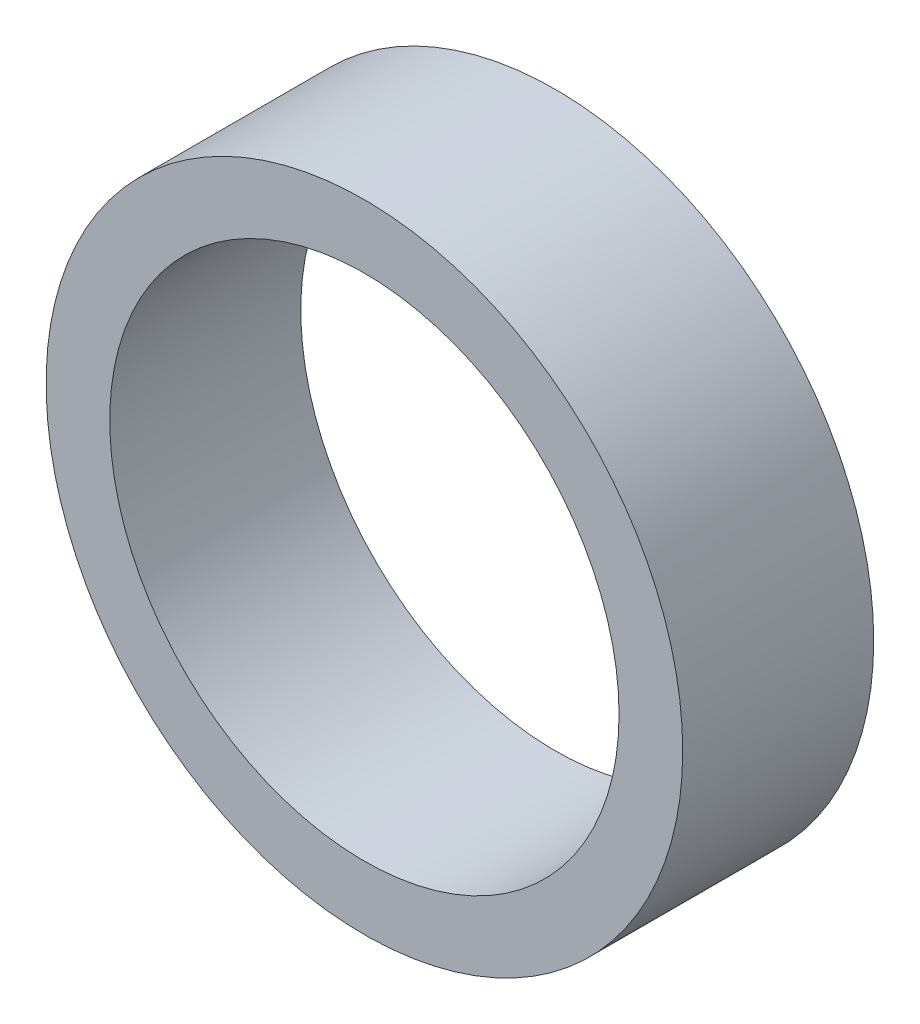
ISO-10303-21;
HEADER;
FILE_DESCRIPTION(('STEP AP214'),'2;1');
FILE_NAME('part.step','',(''),(''),'','','');
FILE_SCHEMA(('AUTOMOTIVE_DESIGN { 1 0 10303 214 1 1 1 1 }'));
ENDSEC;
DATA;
#1=APPLICATION_CONTEXT('core data for automotive mechanical design processes');
#2=APPLICATION_PROTOCOL_DEFINITION('international standard','automotive_design',2000,#1);
#3=PRODUCT_CONTEXT('',#1,'mechanical');
#4=PRODUCT('Part','Part','',(#3));
#5=PRODUCT_RELATED_PRODUCT_CATEGORY('part','',(#4));
#6=PRODUCT_DEFINITION_FORMATION('','',#4);
#7=PRODUCT_DEFINITION_CONTEXT('part definition',#1,'design');
#8=PRODUCT_DEFINITION('design','',#6,#7);
#9=PRODUCT_DEFINITION_SHAPE('','',#8);
#10=(LENGTH_UNIT() NAMED_UNIT(*) SI_UNIT(.MILLI.,.METRE.));
#11=(NAMED_UNIT(*) PLANE_ANGLE_UNIT() SI_UNIT($,.RADIAN.));
#12=(NAMED_UNIT(*) SI_UNIT($,.STERADIAN.) SOLID_ANGLE_UNIT());
#13=UNCERTAINTY_MEASURE_WITH_UNIT(LENGTH_MEASURE(1.E-05),#10,'distance_accuracy_value','');
#14=(GEOMETRIC_REPRESENTATION_CONTEXT(3) GLOBAL_UNCERTAINTY_ASSIGNED_CONTEXT((#13)) GLOBAL_UNIT_ASSIGNED_CONTEXT((#10,
#11,#12)) REPRESENTATION_CONTEXT('',''));
#15=CARTESIAN_POINT('',(0.,0.,0.));
#16=DIRECTION('',(0.,0.,1.));
#17=DIRECTION('',(1.,0.,0.));
#18=AXIS2_PLACEMENT_3D('',#15,#16,#17);
#19=CARTESIAN_POINT('',(0.,0.,30.));
#20=DIRECTION('',(0.,0.,1.));
#21=DIRECTION('',(1.,0.,0.));
#22=AXIS2_PLACEMENT_3D('',#19,#20,#21);
#23=PLANE('',#22);
#24=CARTESIAN_POINT('',(0.,0.,30.));
#25=DIRECTION('',(0.,0.,1.));
#26=DIRECTION('',(1.,0.,0.));
#27=AXIS2_PLACEMENT_3D('',#24,#25,#26);
#28=CIRCLE('',#27,50.);
#29=CARTESIAN_POINT('',(50.,0.,30.));
#30=VERTEX_POINT('',#29);
#31=EDGE_CURVE('E10',#30,#30,#28,.T.);
#32=ORIENTED_EDGE('',*,*,#31,.T.);
#33=EDGE_LOOP('',(#32));
#34=FACE_BOUND('',#33,.T.);
#35=CARTESIAN_POINT('',(0.,0.,30.));
#36=DIRECTION('',(0.,0.,1.));
#37=DIRECTION('',(1.,0.,0.));
#38=AXIS2_PLACEMENT_3D('',#35,#36,#37);
#39=CIRCLE('',#38,40.);
#40=CARTESIAN_POINT('',(40.,0.,30.));
#41=VERTEX_POINT('',#40);
#42=EDGE_CURVE('E50',#41,#41,#39,.T.);
#43=ORIENTED_EDGE('',*,*,#42,.F.);
#44=EDGE_LOOP('',(#43));
#45=FACE_BOUND('',#44,.T.);
#46=ADVANCED_FACE('F37',(#34,#45),#23,.T.);
#47=CARTESIAN_POINT('',(0.,0.,0.));
#48=DIRECTION('',(0.,0.,1.));
#49=DIRECTION('',(1.,0.,0.));
#50=AXIS2_PLACEMENT_3D('',#47,#48,#49);
#51=PLANE('',#50);
#52=CARTESIAN_POINT('',(0.,0.,0.));
#53=DIRECTION('',(0.,0.,1.));
#54=DIRECTION('',(1.,0.,0.));
#55=AXIS2_PLACEMENT_3D('',#52,#53,#54);
#56=CIRCLE('',#55,50.);
#57=CARTESIAN_POINT('',(50.,0.,0.));
#58=VERTEX_POINT('',#57);
#59=EDGE_CURVE('E41',#58,#58,#56,.T.);
#60=ORIENTED_EDGE('',*,*,#59,.F.);
#61=EDGE_LOOP('',(#60));
#62=FACE_BOUND('',#61,.T.);
#63=CARTESIAN_POINT('',(0.,0.,0.));
#64=DIRECTION('',(0.,0.,1.));
#65=DIRECTION('',(1.,0.,0.));
#66=AXIS2_PLACEMENT_3D('',#63,#64,#65);
#67=CIRCLE('',#66,40.);
#68=CARTESIAN_POINT('',(40.,0.,0.));
#69=VERTEX_POINT('',#68);
#70=EDGE_CURVE('E52',#69,#69,#67,.T.);
#71=ORIENTED_EDGE('',*,*,#70,.T.);
#72=EDGE_LOOP('',(#71));
#73=FACE_BOUND('',#72,.T.);
#74=ADVANCED_FACE('F64',(#62,#73),#51,.F.);
#75=CARTESIAN_POINT('',(0.,0.,30.));
#76=DIRECTION('',(0.,0.,-1.));
#77=DIRECTION('',(-1.,0.,0.));
#78=AXIS2_PLACEMENT_3D('',#75,#76,#77);
#79=CYLINDRICAL_SURFACE('',#78,50.);
#80=ORIENTED_EDGE('',*,*,#31,.F.);
#81=EDGE_LOOP('',(#80));
#82=FACE_BOUND('',#81,.T.);
#83=ORIENTED_EDGE('',*,*,#59,.T.);
#84=EDGE_LOOP('',(#83));
#85=FACE_BOUND('',#84,.T.);
#86=ADVANCED_FACE('F39',(#82,#85),#79,.T.);
#87=CARTESIAN_POINT('',(0.,0.,30.));
#88=DIRECTION('',(0.,0.,-1.));
#89=DIRECTION('',(-1.,0.,0.));
#90=AXIS2_PLACEMENT_3D('',#87,#88,#89);
#91=CYLINDRICAL_SURFACE('',#90,40.);
#92=ORIENTED_EDGE('',*,*,#42,.T.);
#93=EDGE_LOOP('',(#92));
#94=FACE_BOUND('',#93,.T.);
#95=ORIENTED_EDGE('',*,*,#70,.F.);
#96=EDGE_LOOP('',(#95));
#97=FACE_BOUND('',#96,.T.);
#98=ADVANCED_FACE('F60',(#94,#97),#91,.F.);
#99=CLOSED_SHELL('',(#46,#74,#86,#98));
#100=MANIFOLD_SOLID_BREP('B2',#99);
#101=ADVANCED_BREP_SHAPE_REPRESENTATION('',(#18,#100),#14);
#102=SHAPE_DEFINITION_REPRESENTATION(#9,#101);
ENDSEC;
END-ISO-10303-21;
